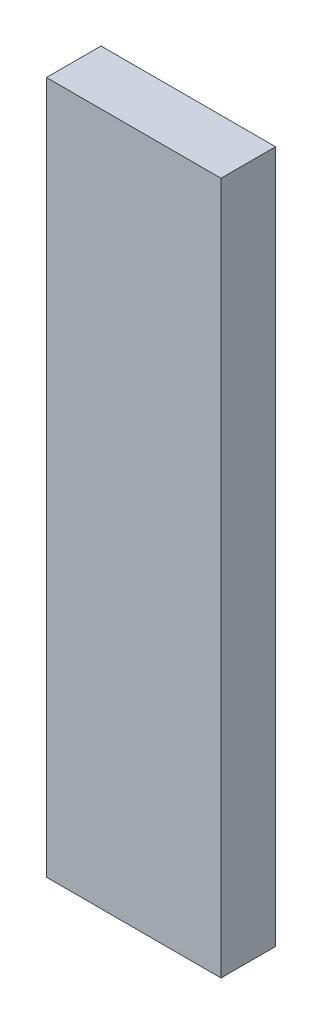
ISO-10303-21;
HEADER;
FILE_DESCRIPTION(('STEP AP214'),'2;1');
FILE_NAME('part.step','',(''),(''),'','','');
FILE_SCHEMA(('AUTOMOTIVE_DESIGN { 1 0 10303 214 1 1 1 1 }'));
ENDSEC;
DATA;
#1=APPLICATION_CONTEXT('core data for automotive mechanical design processes');
#2=APPLICATION_PROTOCOL_DEFINITION('international standard','automotive_design',2000,#1);
#3=PRODUCT_CONTEXT('',#1,'mechanical');
#4=PRODUCT('Part','Part','',(#3));
#5=PRODUCT_RELATED_PRODUCT_CATEGORY('part','',(#4));
#6=PRODUCT_DEFINITION_FORMATION('','',#4);
#7=PRODUCT_DEFINITION_CONTEXT('part definition',#1,'design');
#8=PRODUCT_DEFINITION('design','',#6,#7);
#9=PRODUCT_DEFINITION_SHAPE('','',#8);
#10=(LENGTH_UNIT() NAMED_UNIT(*) SI_UNIT(.MILLI.,.METRE.));
#11=(NAMED_UNIT(*) PLANE_ANGLE_UNIT() SI_UNIT($,.RADIAN.));
#12=(NAMED_UNIT(*) SI_UNIT($,.STERADIAN.) SOLID_ANGLE_UNIT());
#13=UNCERTAINTY_MEASURE_WITH_UNIT(LENGTH_MEASURE(1.E-05),#10,'distance_accuracy_value','');
#14=(GEOMETRIC_REPRESENTATION_CONTEXT(3) GLOBAL_UNCERTAINTY_ASSIGNED_CONTEXT((#13)) GLOBAL_UNIT_ASSIGNED_CONTEXT((#10,
#11,#12)) REPRESENTATION_CONTEXT('',''));
#15=CARTESIAN_POINT('',(0.,0.,0.));
#16=DIRECTION('',(0.,0.,1.));
#17=DIRECTION('',(1.,0.,0.));
#18=AXIS2_PLACEMENT_3D('',#15,#16,#17);
#19=CARTESIAN_POINT('',(0.,0.,0.1));
#20=DIRECTION('',(0.,0.,1.));
#21=DIRECTION('',(1.,0.,0.));
#22=AXIS2_PLACEMENT_3D('',#19,#20,#21);
#23=PLANE('',#22);
#24=DIRECTION('',(0.,1.,0.));
#25=VECTOR('',#24,1.);
#26=CARTESIAN_POINT('',(0.32,0.,0.1));
#27=LINE('',#26,#25);
#28=CARTESIAN_POINT('',(0.32,1.27,0.1));
#29=VERTEX_POINT('',#28);
#30=CARTESIAN_POINT('',(0.32,0.,0.1));
#31=VERTEX_POINT('',#30);
#32=EDGE_CURVE('E76',#29,#31,#27,.F.);
#33=ORIENTED_EDGE('',*,*,#32,.F.);
#34=DIRECTION('',(1.,0.,0.));
#35=VECTOR('',#34,1.);
#36=CARTESIAN_POINT('',(0.,1.27,0.1));
#37=LINE('',#36,#35);
#38=CARTESIAN_POINT('',(0.,1.27,0.1));
#39=VERTEX_POINT('',#38);
#40=EDGE_CURVE('E58',#39,#29,#37,.T.);
#41=ORIENTED_EDGE('',*,*,#40,.F.);
#42=DIRECTION('',(0.,1.,0.));
#43=VECTOR('',#42,1.);
#44=CARTESIAN_POINT('',(0.,0.,0.1));
#45=LINE('',#44,#43);
#46=CARTESIAN_POINT('',(0.,0.,0.1));
#47=VERTEX_POINT('',#46);
#48=EDGE_CURVE('E20',#39,#47,#45,.F.);
#49=ORIENTED_EDGE('',*,*,#48,.T.);
#50=DIRECTION('',(1.,0.,0.));
#51=VECTOR('',#50,1.);
#52=CARTESIAN_POINT('',(0.,0.,0.1));
#53=LINE('',#52,#51);
#54=EDGE_CURVE('E55',#47,#31,#53,.T.);
#55=ORIENTED_EDGE('',*,*,#54,.T.);
#56=EDGE_LOOP('',(#33,#41,#49,#55));
#57=FACE_BOUND('',#56,.T.);
#58=ADVANCED_FACE('F17',(#57),#23,.T.);
#59=CARTESIAN_POINT('',(0.,0.,0.));
#60=DIRECTION('',(1.,0.,0.));
#61=DIRECTION('',(0.,0.,-1.));
#62=AXIS2_PLACEMENT_3D('',#59,#60,#61);
#63=PLANE('',#62);
#64=DIRECTION('',(0.,0.,1.));
#65=VECTOR('',#64,1.);
#66=CARTESIAN_POINT('',(0.,1.27,0.));
#67=LINE('',#66,#65);
#68=CARTESIAN_POINT('',(0.,1.27,0.));
#69=VERTEX_POINT('',#68);
#70=EDGE_CURVE('E78',#69,#39,#67,.T.);
#71=ORIENTED_EDGE('',*,*,#70,.F.);
#72=DIRECTION('',(0.,1.,0.));
#73=VECTOR('',#72,1.);
#74=CARTESIAN_POINT('',(0.,0.,0.));
#75=LINE('',#74,#73);
#76=CARTESIAN_POINT('',(0.,0.,0.));
#77=VERTEX_POINT('',#76);
#78=EDGE_CURVE('E73',#69,#77,#75,.F.);
#79=ORIENTED_EDGE('',*,*,#78,.T.);
#80=DIRECTION('',(0.,0.,1.));
#81=VECTOR('',#80,1.);
#82=CARTESIAN_POINT('',(0.,0.,0.));
#83=LINE('',#82,#81);
#84=EDGE_CURVE('E63',#77,#47,#83,.T.);
#85=ORIENTED_EDGE('',*,*,#84,.T.);
#86=ORIENTED_EDGE('',*,*,#48,.F.);
#87=EDGE_LOOP('',(#71,#79,#85,#86));
#88=FACE_BOUND('',#87,.T.);
#89=ADVANCED_FACE('F72',(#88),#63,.F.);
#90=CARTESIAN_POINT('',(0.,0.,0.));
#91=DIRECTION('',(0.,1.,0.));
#92=DIRECTION('',(0.,0.,1.));
#93=AXIS2_PLACEMENT_3D('',#90,#91,#92);
#94=PLANE('',#93);
#95=ORIENTED_EDGE('',*,*,#54,.F.);
#96=ORIENTED_EDGE('',*,*,#84,.F.);
#97=DIRECTION('',(1.,0.,0.));
#98=VECTOR('',#97,1.);
#99=CARTESIAN_POINT('',(0.,0.,0.));
#100=LINE('',#99,#98);
#101=CARTESIAN_POINT('',(0.32,0.,0.));
#102=VERTEX_POINT('',#101);
#103=EDGE_CURVE('E83',#77,#102,#100,.T.);
#104=ORIENTED_EDGE('',*,*,#103,.T.);
#105=DIRECTION('',(0.,0.,-1.));
#106=VECTOR('',#105,1.);
#107=CARTESIAN_POINT('',(0.32,0.,0.));
#108=LINE('',#107,#106);
#109=EDGE_CURVE('E69',#31,#102,#108,.T.);
#110=ORIENTED_EDGE('',*,*,#109,.F.);
#111=EDGE_LOOP('',(#95,#96,#104,#110));
#112=FACE_BOUND('',#111,.T.);
#113=ADVANCED_FACE('F66',(#112),#94,.F.);
#114=CARTESIAN_POINT('',(0.32,0.,0.));
#115=DIRECTION('',(1.,0.,0.));
#116=DIRECTION('',(0.,0.,-1.));
#117=AXIS2_PLACEMENT_3D('',#114,#115,#116);
#118=PLANE('',#117);
#119=DIRECTION('',(0.,0.,1.));
#120=VECTOR('',#119,1.);
#121=CARTESIAN_POINT('',(0.32,1.27,0.));
#122=LINE('',#121,#120);
#123=CARTESIAN_POINT('',(0.32,1.27,0.));
#124=VERTEX_POINT('',#123);
#125=EDGE_CURVE('E34',#29,#124,#122,.F.);
#126=ORIENTED_EDGE('',*,*,#125,.F.);
#127=ORIENTED_EDGE('',*,*,#32,.T.);
#128=ORIENTED_EDGE('',*,*,#109,.T.);
#129=DIRECTION('',(0.,1.,0.));
#130=VECTOR('',#129,1.);
#131=CARTESIAN_POINT('',(0.32,0.,0.));
#132=LINE('',#131,#130);
#133=EDGE_CURVE('E26',#102,#124,#132,.T.);
#134=ORIENTED_EDGE('',*,*,#133,.T.);
#135=EDGE_LOOP('',(#126,#127,#128,#134));
#136=FACE_BOUND('',#135,.T.);
#137=ADVANCED_FACE('F88',(#136),#118,.T.);
#138=CARTESIAN_POINT('',(0.,1.27,0.));
#139=DIRECTION('',(0.,1.,0.));
#140=DIRECTION('',(0.,0.,1.));
#141=AXIS2_PLACEMENT_3D('',#138,#139,#140);
#142=PLANE('',#141);
#143=ORIENTED_EDGE('',*,*,#40,.T.);
#144=ORIENTED_EDGE('',*,*,#125,.T.);
#145=DIRECTION('',(1.,0.,0.));
#146=VECTOR('',#145,1.);
#147=CARTESIAN_POINT('',(0.,1.27,0.));
#148=LINE('',#147,#146);
#149=EDGE_CURVE('E11',#124,#69,#148,.F.);
#150=ORIENTED_EDGE('',*,*,#149,.T.);
#151=ORIENTED_EDGE('',*,*,#70,.T.);
#152=EDGE_LOOP('',(#143,#144,#150,#151));
#153=FACE_BOUND('',#152,.T.);
#154=ADVANCED_FACE('F91',(#153),#142,.T.);
#155=CARTESIAN_POINT('',(0.,0.,0.));
#156=DIRECTION('',(0.,0.,1.));
#157=DIRECTION('',(1.,0.,0.));
#158=AXIS2_PLACEMENT_3D('',#155,#156,#157);
#159=PLANE('',#158);
#160=ORIENTED_EDGE('',*,*,#133,.F.);
#161=ORIENTED_EDGE('',*,*,#103,.F.);
#162=ORIENTED_EDGE('',*,*,#78,.F.);
#163=ORIENTED_EDGE('',*,*,#149,.F.);
#164=EDGE_LOOP('',(#160,#161,#162,#163));
#165=FACE_BOUND('',#164,.T.);
#166=ADVANCED_FACE('F90',(#165),#159,.F.);
#167=CLOSED_SHELL('',(#58,#89,#113,#137,#154,#166));
#168=MANIFOLD_SOLID_BREP('B1',#167);
#169=ADVANCED_BREP_SHAPE_REPRESENTATION('',(#18,#168),#14);
#170=SHAPE_DEFINITION_REPRESENTATION(#9,#169);
ENDSEC;
END-ISO-10303-21;
